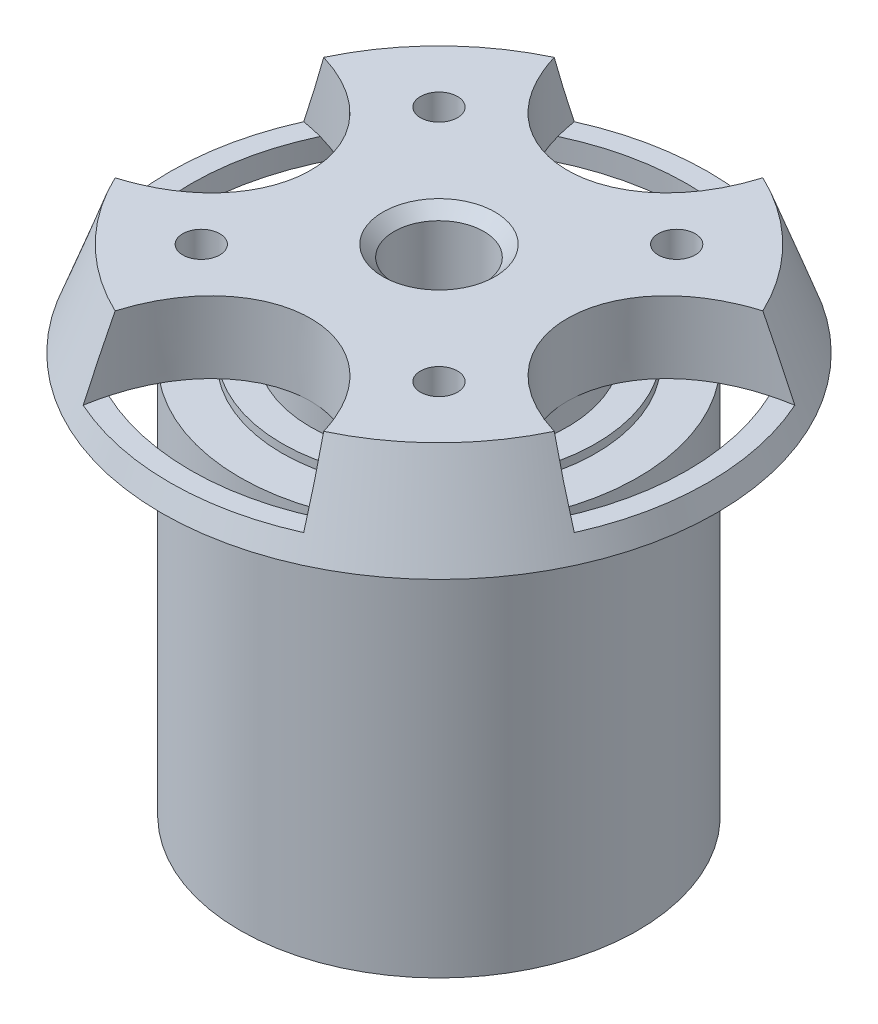
ISO-10303-21;
HEADER;
FILE_DESCRIPTION(('STEP AP214'),'2;1');
FILE_NAME('part.step','',(''),(''),'','','');
FILE_SCHEMA(('AUTOMOTIVE_DESIGN { 1 0 10303 214 1 1 1 1 }'));
ENDSEC;
DATA;
#1=APPLICATION_CONTEXT('core data for automotive mechanical design processes');
#2=APPLICATION_PROTOCOL_DEFINITION('international standard','automotive_design',2000,#1);
#3=PRODUCT_CONTEXT('',#1,'mechanical');
#4=PRODUCT('Part','Part','',(#3));
#5=PRODUCT_RELATED_PRODUCT_CATEGORY('part','',(#4));
#6=PRODUCT_DEFINITION_FORMATION('','',#4);
#7=PRODUCT_DEFINITION_CONTEXT('part definition',#1,'design');
#8=PRODUCT_DEFINITION('design','',#6,#7);
#9=PRODUCT_DEFINITION_SHAPE('','',#8);
#10=(LENGTH_UNIT() NAMED_UNIT(*) SI_UNIT(.MILLI.,.METRE.));
#11=(NAMED_UNIT(*) PLANE_ANGLE_UNIT() SI_UNIT($,.RADIAN.));
#12=(NAMED_UNIT(*) SI_UNIT($,.STERADIAN.) SOLID_ANGLE_UNIT());
#13=UNCERTAINTY_MEASURE_WITH_UNIT(LENGTH_MEASURE(1.E-05),#10,'distance_accuracy_value','');
#14=(GEOMETRIC_REPRESENTATION_CONTEXT(3) GLOBAL_UNCERTAINTY_ASSIGNED_CONTEXT((#13)) GLOBAL_UNIT_ASSIGNED_CONTEXT((#10,
#11,#12)) REPRESENTATION_CONTEXT('',''));
#15=CARTESIAN_POINT('',(0.,0.,0.));
#16=DIRECTION('',(0.,0.,1.));
#17=DIRECTION('',(1.,0.,0.));
#18=AXIS2_PLACEMENT_3D('',#15,#16,#17);
#19=CARTESIAN_POINT('',(0.,0.,0.));
#20=DIRECTION('',(0.,-1.,0.));
#21=DIRECTION('',(0.,0.,-1.));
#22=AXIS2_PLACEMENT_3D('',#19,#20,#21);
#23=CONICAL_SURFACE('',#22,21.6926500321639,0.349065850398867);
#24=CARTESIAN_POINT('',(9.30806662854048,0.,-19.594156298667));
#25=CARTESIAN_POINT('',(9.33645349830446,-0.267047114559313,-19.6882780547998));
#26=CARTESIAN_POINT('',(9.36403935939831,-0.534056252413507,-19.7827485386109));
#27=CARTESIAN_POINT('',(9.41762899385759,-1.06796669210553,-19.9723535420777));
#28=CARTESIAN_POINT('',(9.44363292784184,-1.33486800214883,-20.0674879932214));
#29=CARTESIAN_POINT('',(9.49408274903464,-1.86856773253177,-20.2584004093009));
#30=CARTESIAN_POINT('',(9.51852873826012,-2.13536615846896,-20.3541783316461));
#31=CARTESIAN_POINT('',(9.56588545307037,-2.66886527147613,-20.5463573710002));
#32=CARTESIAN_POINT('',(9.58879622657838,-2.93556596133833,-20.6427584684529));
#33=CARTESIAN_POINT('',(9.63310433714341,-3.46887325652315,-20.8361631457278));
#34=CARTESIAN_POINT('',(9.65450168054505,-3.73547986223553,-20.9331667230224));
#35=CARTESIAN_POINT('',(9.69580425870875,-4.26860624308783,-21.1277571172986));
#36=CARTESIAN_POINT('',(9.71570944184244,-4.53512601490593,-21.2253439543348));
#37=CARTESIAN_POINT('',(9.75404821296801,-5.06808443425027,-21.4210812477819));
#38=CARTESIAN_POINT('',(9.77248170357695,-5.33452307524784,-21.5192317410304));
#39=CARTESIAN_POINT('',(9.80789689017983,-5.86732501125397,-21.7160769996769));
#40=CARTESIAN_POINT('',(9.82487844646639,-6.13368829655945,-21.8147718164802));
#41=CARTESIAN_POINT('',(9.84114289802766,-6.4,-21.9137228830241));
#42=B_SPLINE_CURVE_WITH_KNOTS('',3,(#24,#25,#26,#27,#28,#29,#30,#31,#32,#33,#34,#35,#36,#37,#38,
#39,#40,#41),.UNSPECIFIED.,.F.,.F.,(4,2,2,2,2,2,2,2,4),(0.,0.853702016214532,1.70731720778205,
2.56087644558439,3.41440902627732,4.26793802855804,5.12149654911094,5.97511150350678,
6.82880850184122),.UNSPECIFIED.);
#43=CARTESIAN_POINT('',(9.30806662854051,0.,-19.5941562986671));
#44=VERTEX_POINT('',#43);
#45=CARTESIAN_POINT('',(9.84114289802766,-6.4,-21.9137228830241));
#46=VERTEX_POINT('',#45);
#47=EDGE_CURVE('E350',#44,#46,#42,.T.);
#48=ORIENTED_EDGE('',*,*,#47,.F.);
#49=CARTESIAN_POINT('',(0.,0.,0.));
#50=DIRECTION('',(0.,1.,0.));
#51=DIRECTION('',(0.,0.,1.));
#52=AXIS2_PLACEMENT_3D('',#49,#50,#51);
#53=CIRCLE('',#52,21.6926500321639);
#54=CARTESIAN_POINT('',(19.5941562986671,0.,-9.30806662854027));
#55=VERTEX_POINT('',#54);
#56=EDGE_CURVE('E348',#55,#44,#53,.T.);
#57=ORIENTED_EDGE('',*,*,#56,.F.);
#58=CARTESIAN_POINT('',(21.9137228830242,-6.4,-9.84114289802742));
#59=CARTESIAN_POINT('',(21.8147718164803,-6.13368829655945,-9.82487844646616));
#60=CARTESIAN_POINT('',(21.716076999677,-5.86732501125397,-9.8078968901796));
#61=CARTESIAN_POINT('',(21.5192317410305,-5.33452307524784,-9.77248170357672));
#62=CARTESIAN_POINT('',(21.421081247782,-5.06808443425027,-9.75404821296778));
#63=CARTESIAN_POINT('',(21.2253439543349,-4.53512601490593,-9.71570944184222));
#64=CARTESIAN_POINT('',(21.1277571172987,-4.26860624308782,-9.69580425870853));
#65=CARTESIAN_POINT('',(20.9331667230225,-3.73547986223553,-9.65450168054483));
#66=CARTESIAN_POINT('',(20.8361631457279,-3.46887325652315,-9.63310433714319));
#67=CARTESIAN_POINT('',(20.642758468453,-2.93556596133833,-9.58879622657817));
#68=CARTESIAN_POINT('',(20.5463573710003,-2.66886527147612,-9.56588545307015));
#69=CARTESIAN_POINT('',(20.3541783316462,-2.13536615846895,-9.51852873825991));
#70=CARTESIAN_POINT('',(20.258400409301,-1.86856773253177,-9.49408274903442));
#71=CARTESIAN_POINT('',(20.0674879932215,-1.33486800214883,-9.44363292784162));
#72=CARTESIAN_POINT('',(19.9723535420778,-1.06796669210553,-9.41762899385737));
#73=CARTESIAN_POINT('',(19.782748538611,-0.534056252413505,-9.3640393593981));
#74=CARTESIAN_POINT('',(19.6882780547999,-0.267047114559311,-9.33645349830426));
#75=CARTESIAN_POINT('',(19.5941562986671,0.,-9.30806662854027));
#76=B_SPLINE_CURVE_WITH_KNOTS('',3,(#58,#59,#60,#61,#62,#63,#64,#65,#66,#67,#68,#69,#70,#71,#72,
#73,#74,#75),.UNSPECIFIED.,.F.,.F.,(4,2,2,2,2,2,2,2,4),(0.,0.853696998334435,1.70731195273028,
2.56087047328318,3.4143994755639,4.26793205625684,5.12149129405917,5.97510648562669,
6.82880850184122),.UNSPECIFIED.);
#77=CARTESIAN_POINT('',(21.9137228830242,-6.4,-9.84114289802742));
#78=VERTEX_POINT('',#77);
#79=EDGE_CURVE('E223',#78,#55,#76,.T.);
#80=ORIENTED_EDGE('',*,*,#79,.F.);
#81=CARTESIAN_POINT('',(0.,-6.4,0.));
#82=DIRECTION('',(0.,-1.,0.));
#83=DIRECTION('',(0.,0.,-1.));
#84=AXIS2_PLACEMENT_3D('',#81,#82,#83);
#85=CIRCLE('',#84,24.0220595314676);
#86=CARTESIAN_POINT('',(21.913722883024,-6.4,9.84114289802788));
#87=VERTEX_POINT('',#86);
#88=EDGE_CURVE('E340',#87,#78,#85,.F.);
#89=ORIENTED_EDGE('',*,*,#88,.F.);
#90=CARTESIAN_POINT('',(19.5941562986669,0.,9.30806662854068));
#91=CARTESIAN_POINT('',(19.6882780547997,-0.267047114559311,9.33645349830467));
#92=CARTESIAN_POINT('',(19.7827485386108,-0.534056252413505,9.36403935939852));
#93=CARTESIAN_POINT('',(19.9723535420777,-1.06796669210553,9.41762899385779));
#94=CARTESIAN_POINT('',(20.0674879932213,-1.33486800214883,9.44363292784204));
#95=CARTESIAN_POINT('',(20.2584004093008,-1.86856773253177,9.49408274903485));
#96=CARTESIAN_POINT('',(20.354178331646,-2.13536615846895,9.51852873826034));
#97=CARTESIAN_POINT('',(20.5463573710001,-2.66886527147612,9.56588545307059));
#98=CARTESIAN_POINT('',(20.6427584684528,-2.93556596133833,9.5887962265786));
#99=CARTESIAN_POINT('',(20.8361631457277,-3.46887325652315,9.63310433714362));
#100=CARTESIAN_POINT('',(20.9331667230223,-3.73547986223553,9.65450168054527));
#101=CARTESIAN_POINT('',(21.1277571172985,-4.26860624308782,9.69580425870897));
#102=CARTESIAN_POINT('',(21.2253439543347,-4.53512601490593,9.71570944184266));
#103=CARTESIAN_POINT('',(21.4210812477818,-5.06808443425026,9.75404821296823));
#104=CARTESIAN_POINT('',(21.5192317410303,-5.33452307524784,9.77248170357718));
#105=CARTESIAN_POINT('',(21.7160769996768,-5.86732501125396,9.80789689018005));
#106=CARTESIAN_POINT('',(21.8147718164801,-6.13368829655944,9.82487844646661));
#107=CARTESIAN_POINT('',(21.913722883024,-6.4,9.84114289802788));
#108=B_SPLINE_CURVE_WITH_KNOTS('',3,(#90,#91,#92,#93,#94,#95,#96,#97,#98,#99,#100,#101,#102,
#103,#104,#105,#106,#107),.UNSPECIFIED.,.F.,.F.,(4,2,2,2,2,2,2,2,4),(0.,0.853702016214529,
1.70731720778205,2.56087644558438,3.41440902627731,4.26793802855803,5.12149654911093,
5.97511150350678,6.82880850184121),.UNSPECIFIED.);
#109=CARTESIAN_POINT('',(19.594156298667,0.,9.30806662854072));
#110=VERTEX_POINT('',#109);
#111=EDGE_CURVE('E231',#110,#87,#108,.T.);
#112=ORIENTED_EDGE('',*,*,#111,.F.);
#113=CARTESIAN_POINT('',(9.30806662854048,0.,19.594156298667));
#114=VERTEX_POINT('',#113);
#115=EDGE_CURVE('E353',#114,#110,#53,.T.);
#116=ORIENTED_EDGE('',*,*,#115,.F.);
#117=CARTESIAN_POINT('',(9.84114289802765,-6.4,21.9137228830241));
#118=CARTESIAN_POINT('',(9.82487844646638,-6.13368829655945,21.8147718164802));
#119=CARTESIAN_POINT('',(9.80789689017982,-5.86732501125397,21.7160769996769));
#120=CARTESIAN_POINT('',(9.77248170357695,-5.33452307524785,21.5192317410304));
#121=CARTESIAN_POINT('',(9.75404821296801,-5.06808443425027,21.4210812477819));
#122=CARTESIAN_POINT('',(9.71570944184244,-4.53512601490594,21.2253439543348));
#123=CARTESIAN_POINT('',(9.69580425870875,-4.26860624308783,21.1277571172986));
#124=CARTESIAN_POINT('',(9.65450168054505,-3.73547986223553,20.9331667230224));
#125=CARTESIAN_POINT('',(9.6331043371434,-3.46887325652315,20.8361631457278));
#126=CARTESIAN_POINT('',(9.58879622657838,-2.93556596133833,20.6427584684529));
#127=CARTESIAN_POINT('',(9.56588545307037,-2.66886527147613,20.5463573710002));
#128=CARTESIAN_POINT('',(9.51852873826012,-2.13536615846896,20.3541783316461));
#129=CARTESIAN_POINT('',(9.49408274903464,-1.86856773253177,20.2584004093009));
#130=CARTESIAN_POINT('',(9.44363292784183,-1.33486800214883,20.0674879932214));
#131=CARTESIAN_POINT('',(9.41762899385758,-1.06796669210553,19.9723535420777));
#132=CARTESIAN_POINT('',(9.36403935939831,-0.534056252413507,19.7827485386109));
#133=CARTESIAN_POINT('',(9.33645349830446,-0.267047114559312,19.6882780547998));
#134=CARTESIAN_POINT('',(9.30806662854048,0.,19.594156298667));
#135=B_SPLINE_CURVE_WITH_KNOTS('',3,(#117,#118,#119,#120,#121,#122,#123,#124,#125,#126,#127,
#128,#129,#130,#131,#132,#133,#134),.UNSPECIFIED.,.F.,.F.,(4,2,2,2,2,2,2,2,4),(0.,
0.853696998334435,1.70731195273028,2.56087047328318,3.4143994755639,4.26793205625683,
5.12149129405917,5.97510648562669,6.82880850184122),.UNSPECIFIED.);
#136=CARTESIAN_POINT('',(9.84114289802766,-6.4,21.9137228830241));
#137=VERTEX_POINT('',#136);
#138=EDGE_CURVE('E256',#137,#114,#135,.T.);
#139=ORIENTED_EDGE('',*,*,#138,.F.);
#140=CARTESIAN_POINT('',(0.,-6.4,0.));
#141=DIRECTION('',(0.,-1.,0.));
#142=DIRECTION('',(0.,0.,-1.));
#143=AXIS2_PLACEMENT_3D('',#140,#141,#142);
#144=CIRCLE('',#143,24.0220595314676);
#145=CARTESIAN_POINT('',(-9.84114289802766,-6.4,21.9137228830241));
#146=VERTEX_POINT('',#145);
#147=EDGE_CURVE('E389',#146,#137,#144,.F.);
#148=ORIENTED_EDGE('',*,*,#147,.F.);
#149=CARTESIAN_POINT('',(-9.30806662854047,0.,19.594156298667));
#150=CARTESIAN_POINT('',(-9.33645349830446,-0.267047114559313,19.6882780547998));
#151=CARTESIAN_POINT('',(-9.36403935939831,-0.534056252413508,19.7827485386109));
#152=CARTESIAN_POINT('',(-9.41762899385758,-1.06796669210553,19.9723535420777));
#153=CARTESIAN_POINT('',(-9.44363292784183,-1.33486800214883,20.0674879932214));
#154=CARTESIAN_POINT('',(-9.49408274903464,-1.86856773253177,20.2584004093009));
#155=CARTESIAN_POINT('',(-9.51852873826013,-2.13536615846895,20.3541783316461));
#156=CARTESIAN_POINT('',(-9.56588545307037,-2.66886527147612,20.5463573710002));
#157=CARTESIAN_POINT('',(-9.58879622657839,-2.93556596133833,20.6427584684529));
#158=CARTESIAN_POINT('',(-9.63310433714341,-3.46887325652315,20.8361631457278));
#159=CARTESIAN_POINT('',(-9.65450168054505,-3.73547986223553,20.9331667230224));
#160=CARTESIAN_POINT('',(-9.69580425870875,-4.26860624308783,21.1277571172986));
#161=CARTESIAN_POINT('',(-9.71570944184244,-4.53512601490593,21.2253439543348));
#162=CARTESIAN_POINT('',(-9.75404821296801,-5.06808443425027,21.4210812477819));
#163=CARTESIAN_POINT('',(-9.77248170357695,-5.33452307524784,21.5192317410304));
#164=CARTESIAN_POINT('',(-9.80789689017983,-5.86732501125397,21.7160769996769));
#165=CARTESIAN_POINT('',(-9.82487844646639,-6.13368829655945,21.8147718164802));
#166=CARTESIAN_POINT('',(-9.84114289802766,-6.4,21.9137228830241));
#167=B_SPLINE_CURVE_WITH_KNOTS('',3,(#149,#150,#151,#152,#153,#154,#155,#156,#157,#158,#159,
#160,#161,#162,#163,#164,#165,#166),.UNSPECIFIED.,.F.,.F.,(4,2,2,2,2,2,2,2,4),(0.,
0.853702016214531,1.70731720778205,2.56087644558438,3.41440902627732,4.26793802855804,
5.12149654911094,5.97511150350678,6.82880850184122),.UNSPECIFIED.);
#168=CARTESIAN_POINT('',(-9.30806662854051,0.,19.5941562986671));
#169=VERTEX_POINT('',#168);
#170=EDGE_CURVE('E266',#169,#146,#167,.T.);
#171=ORIENTED_EDGE('',*,*,#170,.F.);
#172=CARTESIAN_POINT('',(-19.594156298667,0.,9.30806662854041));
#173=VERTEX_POINT('',#172);
#174=EDGE_CURVE('E358',#173,#169,#53,.T.);
#175=ORIENTED_EDGE('',*,*,#174,.F.);
#176=CARTESIAN_POINT('',(-21.9137228830241,-6.4,9.84114289802758));
#177=CARTESIAN_POINT('',(-21.8147718164802,-6.13368829655945,9.82487844646631));
#178=CARTESIAN_POINT('',(-21.716076999677,-5.86732501125397,9.80789689017975));
#179=CARTESIAN_POINT('',(-21.5192317410304,-5.33452307524784,9.77248170357687));
#180=CARTESIAN_POINT('',(-21.4210812477819,-5.06808443425027,9.75404821296793));
#181=CARTESIAN_POINT('',(-21.2253439543349,-4.53512601490594,9.71570944184236));
#182=CARTESIAN_POINT('',(-21.1277571172987,-4.26860624308783,9.69580425870868));
#183=CARTESIAN_POINT('',(-20.9331667230224,-3.73547986223554,9.65450168054498));
#184=CARTESIAN_POINT('',(-20.8361631457278,-3.46887325652316,9.63310433714333));
#185=CARTESIAN_POINT('',(-20.6427584684529,-2.93556596133833,9.58879622657831));
#186=CARTESIAN_POINT('',(-20.5463573710002,-2.66886527147613,9.5658854530703));
#187=CARTESIAN_POINT('',(-20.3541783316461,-2.13536615846896,9.51852873826005));
#188=CARTESIAN_POINT('',(-20.2584004093009,-1.86856773253177,9.49408274903456));
#189=CARTESIAN_POINT('',(-20.0674879932215,-1.33486800214883,9.44363292784176));
#190=CARTESIAN_POINT('',(-19.9723535420778,-1.06796669210553,9.41762899385751));
#191=CARTESIAN_POINT('',(-19.7827485386109,-0.53405625241351,9.36403935939824));
#192=CARTESIAN_POINT('',(-19.6882780547998,-0.267047114559314,9.33645349830439));
#193=CARTESIAN_POINT('',(-19.594156298667,0.,9.30806662854041));
#194=B_SPLINE_CURVE_WITH_KNOTS('',3,(#176,#177,#178,#179,#180,#181,#182,#183,#184,#185,#186,
#187,#188,#189,#190,#191,#192,#193),.UNSPECIFIED.,.F.,.F.,(4,2,2,2,2,2,2,2,4),(0.,
0.853696998334433,1.70731195273028,2.56087047328318,3.4143994755639,4.26793205625683,
5.12149129405917,5.97510648562668,6.82880850184121),.UNSPECIFIED.);
#195=CARTESIAN_POINT('',(-21.9137228830241,-6.4,9.84114289802758));
#196=VERTEX_POINT('',#195);
#197=EDGE_CURVE('E274',#196,#173,#194,.T.);
#198=ORIENTED_EDGE('',*,*,#197,.F.);
#199=CARTESIAN_POINT('',(0.,-6.4,0.));
#200=DIRECTION('',(0.,-1.,0.));
#201=DIRECTION('',(0.,0.,-1.));
#202=AXIS2_PLACEMENT_3D('',#199,#200,#201);
#203=CIRCLE('',#202,24.0220595314676);
#204=CARTESIAN_POINT('',(-21.9137228830241,-6.4,-9.84114289802773));
#205=VERTEX_POINT('',#204);
#206=EDGE_CURVE('E342',#205,#196,#203,.F.);
#207=ORIENTED_EDGE('',*,*,#206,.F.);
#208=CARTESIAN_POINT('',(-19.594156298667,0.,-9.30806662854054));
#209=CARTESIAN_POINT('',(-19.6882780547998,-0.267047114559312,-9.33645349830453));
#210=CARTESIAN_POINT('',(-19.7827485386109,-0.534056252413505,-9.36403935939838));
#211=CARTESIAN_POINT('',(-19.9723535420777,-1.06796669210552,-9.41762899385765));
#212=CARTESIAN_POINT('',(-20.0674879932214,-1.33486800214883,-9.4436329278419));
#213=CARTESIAN_POINT('',(-20.2584004093009,-1.86856773253177,-9.49408274903471));
#214=CARTESIAN_POINT('',(-20.3541783316461,-2.13536615846895,-9.5185287382602));
#215=CARTESIAN_POINT('',(-20.5463573710001,-2.66886527147612,-9.56588545307044));
#216=CARTESIAN_POINT('',(-20.6427584684528,-2.93556596133833,-9.58879622657846));
#217=CARTESIAN_POINT('',(-20.8361631457278,-3.46887325652315,-9.63310433714348));
#218=CARTESIAN_POINT('',(-20.9331667230224,-3.73547986223553,-9.65450168054512));
#219=CARTESIAN_POINT('',(-21.1277571172986,-4.26860624308782,-9.69580425870883));
#220=CARTESIAN_POINT('',(-21.2253439543348,-4.53512601490593,-9.71570944184251));
#221=CARTESIAN_POINT('',(-21.4210812477818,-5.06808443425027,-9.75404821296808));
#222=CARTESIAN_POINT('',(-21.5192317410304,-5.33452307524784,-9.77248170357703));
#223=CARTESIAN_POINT('',(-21.7160769996769,-5.86732501125397,-9.8078968901799));
#224=CARTESIAN_POINT('',(-21.8147718164801,-6.13368829655945,-9.82487844646647));
#225=CARTESIAN_POINT('',(-21.9137228830241,-6.4,-9.84114289802773));
#226=B_SPLINE_CURVE_WITH_KNOTS('',3,(#208,#209,#210,#211,#212,#213,#214,#215,#216,#217,#218,
#219,#220,#221,#222,#223,#224,#225),.UNSPECIFIED.,.F.,.F.,(4,2,2,2,2,2,2,2,4),(0.,
0.853702016214529,1.70731720778205,2.56087644558438,3.41440902627732,4.26793802855804,
5.12149654911094,5.97511150350679,6.82880850184122),.UNSPECIFIED.);
#227=CARTESIAN_POINT('',(-19.5941562986671,0.,-9.30806662854058));
#228=VERTEX_POINT('',#227);
#229=EDGE_CURVE('E282',#228,#205,#226,.T.);
#230=ORIENTED_EDGE('',*,*,#229,.F.);
#231=CARTESIAN_POINT('',(-9.30806662854048,0.,-19.594156298667));
#232=VERTEX_POINT('',#231);
#233=EDGE_CURVE('E354',#232,#228,#53,.T.);
#234=ORIENTED_EDGE('',*,*,#233,.F.);
#235=CARTESIAN_POINT('',(-9.84114289802765,-6.4,-21.9137228830241));
#236=CARTESIAN_POINT('',(-9.82487844646638,-6.13368829655945,-21.8147718164802));
#237=CARTESIAN_POINT('',(-9.80789689017982,-5.86732501125397,-21.7160769996769));
#238=CARTESIAN_POINT('',(-9.77248170357695,-5.33452307524785,-21.5192317410304));
#239=CARTESIAN_POINT('',(-9.75404821296801,-5.06808443425027,-21.4210812477819));
#240=CARTESIAN_POINT('',(-9.71570944184244,-4.53512601490594,-21.2253439543348));
#241=CARTESIAN_POINT('',(-9.69580425870875,-4.26860624308783,-21.1277571172986));
#242=CARTESIAN_POINT('',(-9.65450168054505,-3.73547986223553,-20.9331667230224));
#243=CARTESIAN_POINT('',(-9.6331043371434,-3.46887325652315,-20.8361631457278));
#244=CARTESIAN_POINT('',(-9.58879622657838,-2.93556596133833,-20.6427584684529));
#245=CARTESIAN_POINT('',(-9.56588545307037,-2.66886527147613,-20.5463573710002));
#246=CARTESIAN_POINT('',(-9.51852873826012,-2.13536615846896,-20.3541783316461));
#247=CARTESIAN_POINT('',(-9.49408274903464,-1.86856773253177,-20.2584004093009));
#248=CARTESIAN_POINT('',(-9.44363292784183,-1.33486800214883,-20.0674879932214));
#249=CARTESIAN_POINT('',(-9.41762899385758,-1.06796669210553,-19.9723535420777));
#250=CARTESIAN_POINT('',(-9.36403935939831,-0.534056252413507,-19.7827485386109));
#251=CARTESIAN_POINT('',(-9.33645349830446,-0.267047114559312,-19.6882780547998));
#252=CARTESIAN_POINT('',(-9.30806662854048,0.,-19.594156298667));
#253=B_SPLINE_CURVE_WITH_KNOTS('',3,(#235,#236,#237,#238,#239,#240,#241,#242,#243,#244,#245,
#246,#247,#248,#249,#250,#251,#252),.UNSPECIFIED.,.F.,.F.,(4,2,2,2,2,2,2,2,4),(0.,
0.853696998334435,1.70731195273028,2.56087047328318,3.4143994755639,4.26793205625683,
5.12149129405917,5.97510648562669,6.82880850184122),.UNSPECIFIED.);
#254=CARTESIAN_POINT('',(-9.84114289802766,-6.4,-21.9137228830241));
#255=VERTEX_POINT('',#254);
#256=EDGE_CURVE('E237',#255,#232,#253,.T.);
#257=ORIENTED_EDGE('',*,*,#256,.F.);
#258=CARTESIAN_POINT('',(0.,-6.4,0.));
#259=DIRECTION('',(0.,-1.,0.));
#260=DIRECTION('',(0.,0.,-1.));
#261=AXIS2_PLACEMENT_3D('',#258,#259,#260);
#262=CIRCLE('',#261,24.0220595314676);
#263=EDGE_CURVE('E42',#46,#255,#262,.F.);
#264=ORIENTED_EDGE('',*,*,#263,.F.);
#265=EDGE_LOOP('',(#48,#57,#80,#89,#112,#116,#139,#148,#171,#175,#198,#207,#230,#234,#257,#264));
#266=FACE_BOUND('',#265,.T.);
#267=CARTESIAN_POINT('',(0.,-8.4,0.));
#268=DIRECTION('',(0.,1.,0.));
#269=DIRECTION('',(0.,0.,1.));
#270=AXIS2_PLACEMENT_3D('',#267,#268,#269);
#271=CIRCLE('',#270,24.75);
#272=CARTESIAN_POINT('',(0.,-8.4,24.75));
#273=VERTEX_POINT('',#272);
#274=EDGE_CURVE('E357',#273,#273,#271,.T.);
#275=ORIENTED_EDGE('',*,*,#274,.T.);
#276=EDGE_LOOP('',(#275));
#277=FACE_BOUND('',#276,.T.);
#278=ADVANCED_FACE('F34',(#266,#277),#23,.T.);
#279=CARTESIAN_POINT('',(0.,0.,0.));
#280=DIRECTION('',(0.,1.,0.));
#281=DIRECTION('',(0.,0.,1.));
#282=AXIS2_PLACEMENT_3D('',#279,#280,#281);
#283=PLANE('',#282);
#284=CARTESIAN_POINT('',(9.95,0.,-22.661862235924));
#285=CARTESIAN_POINT('',(8.05,0.,-7.71271258802532));
#286=CARTESIAN_POINT('',(-8.05,0.,-7.71271258802532));
#287=CARTESIAN_POINT('',(-9.95,0.,-22.661862235924));
#288=B_SPLINE_CURVE_WITH_KNOTS('',3,(#284,#285,#286,#287),.UNSPECIFIED.,.F.,.F.,(4,4),(0.,1.),.UNSPECIFIED.);
#289=EDGE_CURVE('E406',#232,#44,#288,.F.);
#290=ORIENTED_EDGE('',*,*,#289,.F.);
#291=ORIENTED_EDGE('',*,*,#233,.T.);
#292=CARTESIAN_POINT('',(-22.661862235924,0.,-9.95000000000008));
#293=CARTESIAN_POINT('',(-7.71271258802529,0.,-8.05000000000003));
#294=CARTESIAN_POINT('',(-7.71271258802535,0.,8.04999999999997));
#295=CARTESIAN_POINT('',(-22.6618622359241,0.,9.94999999999992));
#296=B_SPLINE_CURVE_WITH_KNOTS('',3,(#292,#293,#294,#295),.UNSPECIFIED.,.F.,.F.,(4,4),(0.,1.),.UNSPECIFIED.);
#297=EDGE_CURVE('E395',#173,#228,#296,.F.);
#298=ORIENTED_EDGE('',*,*,#297,.F.);
#299=ORIENTED_EDGE('',*,*,#174,.T.);
#300=CARTESIAN_POINT('',(-9.95,0.,22.661862235924));
#301=CARTESIAN_POINT('',(-8.05,0.,7.71271258802532));
#302=CARTESIAN_POINT('',(8.05,0.,7.71271258802532));
#303=CARTESIAN_POINT('',(9.95,0.,22.661862235924));
#304=B_SPLINE_CURVE_WITH_KNOTS('',3,(#300,#301,#302,#303),.UNSPECIFIED.,.F.,.F.,(4,4),(0.,1.),.UNSPECIFIED.);
#305=EDGE_CURVE('E384',#114,#169,#304,.F.);
#306=ORIENTED_EDGE('',*,*,#305,.F.);
#307=ORIENTED_EDGE('',*,*,#115,.T.);
#308=CARTESIAN_POINT('',(22.6618622359239,0.,9.95000000000024));
#309=CARTESIAN_POINT('',(7.71271258802524,0.,8.05000000000008));
#310=CARTESIAN_POINT('',(7.71271258802541,0.,-8.04999999999992));
#311=CARTESIAN_POINT('',(22.6618622359241,0.,-9.94999999999976));
#312=B_SPLINE_CURVE_WITH_KNOTS('',3,(#308,#309,#310,#311),.UNSPECIFIED.,.F.,.F.,(4,4),(0.,1.),.UNSPECIFIED.);
#313=EDGE_CURVE('E399',#55,#110,#312,.F.);
#314=ORIENTED_EDGE('',*,*,#313,.F.);
#315=ORIENTED_EDGE('',*,*,#56,.T.);
#316=EDGE_LOOP('',(#290,#291,#298,#299,#306,#307,#314,#315));
#317=FACE_BOUND('',#316,.T.);
#318=CARTESIAN_POINT('',(0.,0.,0.));
#319=DIRECTION('',(0.,1.,0.));
#320=DIRECTION('',(0.,0.,1.));
#321=AXIS2_PLACEMENT_3D('',#318,#319,#320);
#322=CIRCLE('',#321,4.99999999999997);
#323=CARTESIAN_POINT('',(0.,0.,4.99999999999997));
#324=VERTEX_POINT('',#323);
#325=EDGE_CURVE('E381',#324,#324,#322,.F.);
#326=ORIENTED_EDGE('',*,*,#325,.T.);
#327=EDGE_LOOP('',(#326));
#328=FACE_BOUND('',#327,.T.);
#329=CARTESIAN_POINT('',(10.6066017177982,0.,10.6066017177982));
#330=DIRECTION('',(0.,1.,0.));
#331=DIRECTION('',(0.,0.,1.));
#332=AXIS2_PLACEMENT_3D('',#329,#330,#331);
#333=CIRCLE('',#332,1.64999999999999);
#334=CARTESIAN_POINT('',(10.6066017177982,0.,12.2566017177982));
#335=VERTEX_POINT('',#334);
#336=EDGE_CURVE('E455',#335,#335,#333,.T.);
#337=ORIENTED_EDGE('',*,*,#336,.F.);
#338=EDGE_LOOP('',(#337));
#339=FACE_BOUND('',#338,.T.);
#340=CARTESIAN_POINT('',(-10.6066017177982,0.,10.6066017177982));
#341=DIRECTION('',(0.,1.,0.));
#342=DIRECTION('',(0.,0.,1.));
#343=AXIS2_PLACEMENT_3D('',#340,#341,#342);
#344=CIRCLE('',#343,1.64999999999999);
#345=CARTESIAN_POINT('',(-10.6066017177982,0.,12.2566017177982));
#346=VERTEX_POINT('',#345);
#347=EDGE_CURVE('E459',#346,#346,#344,.T.);
#348=ORIENTED_EDGE('',*,*,#347,.F.);
#349=EDGE_LOOP('',(#348));
#350=FACE_BOUND('',#349,.T.);
#351=CARTESIAN_POINT('',(-10.6066017177982,0.,-10.6066017177982));
#352=DIRECTION('',(0.,1.,0.));
#353=DIRECTION('',(0.,0.,1.));
#354=AXIS2_PLACEMENT_3D('',#351,#352,#353);
#355=CIRCLE('',#354,1.64999999999999);
#356=CARTESIAN_POINT('',(-10.6066017177982,0.,-8.95660171779822));
#357=VERTEX_POINT('',#356);
#358=EDGE_CURVE('E463',#357,#357,#355,.T.);
#359=ORIENTED_EDGE('',*,*,#358,.F.);
#360=EDGE_LOOP('',(#359));
#361=FACE_BOUND('',#360,.T.);
#362=CARTESIAN_POINT('',(10.6066017177982,0.,-10.6066017177982));
#363=DIRECTION('',(0.,1.,0.));
#364=DIRECTION('',(0.,0.,1.));
#365=AXIS2_PLACEMENT_3D('',#362,#363,#364);
#366=CIRCLE('',#365,1.64999999999999);
#367=CARTESIAN_POINT('',(10.6066017177982,0.,-8.95660171779822));
#368=VERTEX_POINT('',#367);
#369=EDGE_CURVE('E362',#368,#368,#366,.T.);
#370=ORIENTED_EDGE('',*,*,#369,.F.);
#371=EDGE_LOOP('',(#370));
#372=FACE_BOUND('',#371,.T.);
#373=ADVANCED_FACE('F247',(#317,#328,#339,#350,#361,#372),#283,.T.);
#374=CARTESIAN_POINT('',(0.,46.5537,0.));
#375=DIRECTION('',(0.,1.,0.));
#376=DIRECTION('',(0.,0.,1.));
#377=AXIS2_PLACEMENT_3D('',#374,#375,#376);
#378=CYLINDRICAL_SURFACE('',#377,3.99999999999997);
#379=CARTESIAN_POINT('',(0.,-0.999999999999994,0.));
#380=DIRECTION('',(0.,1.,0.));
#381=DIRECTION('',(0.,0.,1.));
#382=AXIS2_PLACEMENT_3D('',#379,#380,#381);
#383=CIRCLE('',#382,3.99999999999997);
#384=CARTESIAN_POINT('',(0.,-0.999999999999994,3.99999999999997));
#385=VERTEX_POINT('',#384);
#386=EDGE_CURVE('E378',#385,#385,#383,.T.);
#387=ORIENTED_EDGE('',*,*,#386,.T.);
#388=EDGE_LOOP('',(#387));
#389=FACE_BOUND('',#388,.T.);
#390=CARTESIAN_POINT('',(0.,-44.15,0.));
#391=DIRECTION('',(0.,1.,0.));
#392=DIRECTION('',(0.,0.,1.));
#393=AXIS2_PLACEMENT_3D('',#390,#391,#392);
#394=CIRCLE('',#393,3.99999999999997);
#395=CARTESIAN_POINT('',(0.,-44.15,3.99999999999997));
#396=VERTEX_POINT('',#395);
#397=EDGE_CURVE('E375',#396,#396,#394,.T.);
#398=ORIENTED_EDGE('',*,*,#397,.F.);
#399=EDGE_LOOP('',(#398));
#400=FACE_BOUND('',#399,.T.);
#401=ADVANCED_FACE('F249',(#389,#400),#378,.F.);
#402=CARTESIAN_POINT('',(0.,-8.4,0.));
#403=DIRECTION('',(0.,-1.,0.));
#404=DIRECTION('',(0.,0.,-1.));
#405=AXIS2_PLACEMENT_3D('',#402,#403,#404);
#406=PLANE('',#405);
#407=CARTESIAN_POINT('',(0.,-8.4,0.));
#408=DIRECTION('',(0.,1.,0.));
#409=DIRECTION('',(0.,0.,1.));
#410=AXIS2_PLACEMENT_3D('',#407,#408,#409);
#411=CIRCLE('',#410,22.15);
#412=CARTESIAN_POINT('',(0.,-8.4,22.15));
#413=VERTEX_POINT('',#412);
#414=EDGE_CURVE('E491',#413,#413,#411,.T.);
#415=ORIENTED_EDGE('',*,*,#414,.T.);
#416=EDGE_LOOP('',(#415));
#417=FACE_BOUND('',#416,.T.);
#418=ORIENTED_EDGE('',*,*,#274,.F.);
#419=EDGE_LOOP('',(#418));
#420=FACE_BOUND('',#419,.T.);
#421=ADVANCED_FACE('F251',(#417,#420),#406,.T.);
#422=CARTESIAN_POINT('',(0.,46.5537,0.));
#423=DIRECTION('',(0.,1.,0.));
#424=DIRECTION('',(0.,0.,1.));
#425=AXIS2_PLACEMENT_3D('',#422,#423,#424);
#426=CYLINDRICAL_SURFACE('',#425,14.);
#427=CARTESIAN_POINT('',(0.,-9.15000000000001,0.));
#428=DIRECTION('',(0.,1.,0.));
#429=DIRECTION('',(0.,0.,1.));
#430=AXIS2_PLACEMENT_3D('',#427,#428,#429);
#431=CIRCLE('',#430,14.);
#432=CARTESIAN_POINT('',(0.,-9.15000000000001,14.));
#433=VERTEX_POINT('',#432);
#434=EDGE_CURVE('E366',#433,#433,#431,.T.);
#435=ORIENTED_EDGE('',*,*,#434,.T.);
#436=EDGE_LOOP('',(#435));
#437=FACE_BOUND('',#436,.T.);
#438=CARTESIAN_POINT('',(0.,-8.4,0.));
#439=DIRECTION('',(0.,1.,0.));
#440=DIRECTION('',(0.,0.,1.));
#441=AXIS2_PLACEMENT_3D('',#438,#439,#440);
#442=CIRCLE('',#441,14.);
#443=CARTESIAN_POINT('',(0.,-8.4,14.));
#444=VERTEX_POINT('',#443);
#445=EDGE_CURVE('E194',#444,#444,#442,.F.);
#446=ORIENTED_EDGE('',*,*,#445,.T.);
#447=EDGE_LOOP('',(#446));
#448=FACE_BOUND('',#447,.T.);
#449=ADVANCED_FACE('F562',(#437,#448),#426,.T.);
#450=CARTESIAN_POINT('',(0.,-9.15,0.));
#451=DIRECTION('',(0.,1.,0.));
#452=DIRECTION('',(0.,0.,1.));
#453=AXIS2_PLACEMENT_3D('',#450,#451,#452);
#454=PLANE('',#453);
#455=CARTESIAN_POINT('',(0.,-9.15000000000001,0.));
#456=DIRECTION('',(0.,1.,0.));
#457=DIRECTION('',(0.,0.,1.));
#458=AXIS2_PLACEMENT_3D('',#455,#456,#457);
#459=CIRCLE('',#458,17.75);
#460=CARTESIAN_POINT('',(0.,-9.15000000000001,17.75));
#461=VERTEX_POINT('',#460);
#462=EDGE_CURVE('E369',#461,#461,#459,.T.);
#463=ORIENTED_EDGE('',*,*,#462,.T.);
#464=EDGE_LOOP('',(#463));
#465=FACE_BOUND('',#464,.T.);
#466=ORIENTED_EDGE('',*,*,#434,.F.);
#467=EDGE_LOOP('',(#466));
#468=FACE_BOUND('',#467,.T.);
#469=ADVANCED_FACE('F556',(#465,#468),#454,.T.);
#470=CARTESIAN_POINT('',(0.,46.5537,0.));
#471=DIRECTION('',(0.,1.,0.));
#472=DIRECTION('',(0.,0.,1.));
#473=AXIS2_PLACEMENT_3D('',#470,#471,#472);
#474=CYLINDRICAL_SURFACE('',#473,17.75);
#475=CARTESIAN_POINT('',(0.,-44.15,0.));
#476=DIRECTION('',(0.,1.,0.));
#477=DIRECTION('',(0.,0.,1.));
#478=AXIS2_PLACEMENT_3D('',#475,#476,#477);
#479=CIRCLE('',#478,17.75);
#480=CARTESIAN_POINT('',(0.,-44.15,17.75));
#481=VERTEX_POINT('',#480);
#482=EDGE_CURVE('E372',#481,#481,#479,.T.);
#483=ORIENTED_EDGE('',*,*,#482,.T.);
#484=EDGE_LOOP('',(#483));
#485=FACE_BOUND('',#484,.T.);
#486=ORIENTED_EDGE('',*,*,#462,.F.);
#487=EDGE_LOOP('',(#486));
#488=FACE_BOUND('',#487,.T.);
#489=ADVANCED_FACE('F527',(#485,#488),#474,.T.);
#490=CARTESIAN_POINT('',(0.,-44.15,0.));
#491=DIRECTION('',(0.,-1.,0.));
#492=DIRECTION('',(0.,0.,-1.));
#493=AXIS2_PLACEMENT_3D('',#490,#491,#492);
#494=PLANE('',#493);
#495=ORIENTED_EDGE('',*,*,#397,.T.);
#496=EDGE_LOOP('',(#495));
#497=FACE_BOUND('',#496,.T.);
#498=ORIENTED_EDGE('',*,*,#482,.F.);
#499=EDGE_LOOP('',(#498));
#500=FACE_BOUND('',#499,.T.);
#501=ADVANCED_FACE('F519',(#497,#500),#494,.T.);
#502=CARTESIAN_POINT('',(10.6066017177982,0.,-10.6066017177982));
#503=DIRECTION('',(0.,1.,0.));
#504=DIRECTION('',(0.,0.,1.));
#505=AXIS2_PLACEMENT_3D('',#502,#503,#504);
#506=CYLINDRICAL_SURFACE('',#505,1.64999999999999);
#507=CARTESIAN_POINT('',(10.6066017177982,-6.4,-10.6066017177982));
#508=DIRECTION('',(0.,1.,0.));
#509=DIRECTION('',(0.,0.,1.));
#510=AXIS2_PLACEMENT_3D('',#507,#508,#509);
#511=CIRCLE('',#510,1.64999999999999);
#512=CARTESIAN_POINT('',(10.6066017177982,-6.4,-8.95660171779822));
#513=VERTEX_POINT('',#512);
#514=EDGE_CURVE('E191',#513,#513,#511,.F.);
#515=ORIENTED_EDGE('',*,*,#514,.T.);
#516=EDGE_LOOP('',(#515));
#517=FACE_BOUND('',#516,.T.);
#518=ORIENTED_EDGE('',*,*,#369,.T.);
#519=EDGE_LOOP('',(#518));
#520=FACE_BOUND('',#519,.T.);
#521=ADVANCED_FACE('F516',(#517,#520),#506,.F.);
#522=CARTESIAN_POINT('',(-10.6066017177982,0.,-10.6066017177982));
#523=DIRECTION('',(0.,1.,0.));
#524=DIRECTION('',(0.,0.,1.));
#525=AXIS2_PLACEMENT_3D('',#522,#523,#524);
#526=CYLINDRICAL_SURFACE('',#525,1.64999999999999);
#527=CARTESIAN_POINT('',(-10.6066017177982,-6.4,-10.6066017177982));
#528=DIRECTION('',(0.,1.,0.));
#529=DIRECTION('',(0.,0.,1.));
#530=AXIS2_PLACEMENT_3D('',#527,#528,#529);
#531=CIRCLE('',#530,1.64999999999999);
#532=CARTESIAN_POINT('',(-10.6066017177982,-6.4,-8.95660171779822));
#533=VERTEX_POINT('',#532);
#534=EDGE_CURVE('E188',#533,#533,#531,.F.);
#535=ORIENTED_EDGE('',*,*,#534,.T.);
#536=EDGE_LOOP('',(#535));
#537=FACE_BOUND('',#536,.T.);
#538=ORIENTED_EDGE('',*,*,#358,.T.);
#539=EDGE_LOOP('',(#538));
#540=FACE_BOUND('',#539,.T.);
#541=ADVANCED_FACE('F518',(#537,#540),#526,.F.);
#542=CARTESIAN_POINT('',(-10.6066017177982,0.,10.6066017177982));
#543=DIRECTION('',(0.,1.,0.));
#544=DIRECTION('',(0.,0.,1.));
#545=AXIS2_PLACEMENT_3D('',#542,#543,#544);
#546=CYLINDRICAL_SURFACE('',#545,1.64999999999999);
#547=CARTESIAN_POINT('',(-10.6066017177982,-6.4,10.6066017177982));
#548=DIRECTION('',(0.,1.,0.));
#549=DIRECTION('',(0.,0.,1.));
#550=AXIS2_PLACEMENT_3D('',#547,#548,#549);
#551=CIRCLE('',#550,1.64999999999999);
#552=CARTESIAN_POINT('',(-10.6066017177982,-6.4,12.2566017177982));
#553=VERTEX_POINT('',#552);
#554=EDGE_CURVE('E174',#553,#553,#551,.F.);
#555=ORIENTED_EDGE('',*,*,#554,.T.);
#556=EDGE_LOOP('',(#555));
#557=FACE_BOUND('',#556,.T.);
#558=ORIENTED_EDGE('',*,*,#347,.T.);
#559=EDGE_LOOP('',(#558));
#560=FACE_BOUND('',#559,.T.);
#561=ADVANCED_FACE('F524',(#557,#560),#546,.F.);
#562=CARTESIAN_POINT('',(10.6066017177982,0.,10.6066017177982));
#563=DIRECTION('',(0.,1.,0.));
#564=DIRECTION('',(0.,0.,1.));
#565=AXIS2_PLACEMENT_3D('',#562,#563,#564);
#566=CYLINDRICAL_SURFACE('',#565,1.64999999999999);
#567=CARTESIAN_POINT('',(10.6066017177982,-6.4,10.6066017177982));
#568=DIRECTION('',(0.,1.,0.));
#569=DIRECTION('',(0.,0.,1.));
#570=AXIS2_PLACEMENT_3D('',#567,#568,#569);
#571=CIRCLE('',#570,1.64999999999999);
#572=CARTESIAN_POINT('',(10.6066017177982,-6.4,12.2566017177982));
#573=VERTEX_POINT('',#572);
#574=EDGE_CURVE('E172',#573,#573,#571,.F.);
#575=ORIENTED_EDGE('',*,*,#574,.T.);
#576=EDGE_LOOP('',(#575));
#577=FACE_BOUND('',#576,.T.);
#578=ORIENTED_EDGE('',*,*,#336,.T.);
#579=EDGE_LOOP('',(#578));
#580=FACE_BOUND('',#579,.T.);
#581=ADVANCED_FACE('F533',(#577,#580),#566,.F.);
#582=CARTESIAN_POINT('',(0.,-0.999999999999994,0.));
#583=DIRECTION('',(0.,1.,0.));
#584=DIRECTION('',(0.,0.,1.));
#585=AXIS2_PLACEMENT_3D('',#582,#583,#584);
#586=CONICAL_SURFACE('',#585,3.99999999999997,0.785398163397453);
#587=ORIENTED_EDGE('',*,*,#325,.F.);
#588=EDGE_LOOP('',(#587));
#589=FACE_BOUND('',#588,.T.);
#590=ORIENTED_EDGE('',*,*,#386,.F.);
#591=EDGE_LOOP('',(#590));
#592=FACE_BOUND('',#591,.T.);
#593=ADVANCED_FACE('F36',(#589,#592),#586,.F.);
#594=CARTESIAN_POINT('',(-9.95,0.,22.661862235924));
#595=CARTESIAN_POINT('',(-8.05,0.,7.71271258802532));
#596=CARTESIAN_POINT('',(8.05,0.,7.71271258802532));
#597=CARTESIAN_POINT('',(9.95,0.,22.661862235924));
#598=B_SPLINE_CURVE_WITH_KNOTS('',3,(#594,#595,#596,#597),.UNSPECIFIED.,.F.,.F.,(4,4),(0.,1.),.UNSPECIFIED.);
#599=DIRECTION('',(0.,-1.,0.));
#600=VECTOR('',#599,1.);
#601=SURFACE_OF_LINEAR_EXTRUSION('',#598,#600);
#602=ORIENTED_EDGE('',*,*,#170,.T.);
#603=CARTESIAN_POINT('',(-9.95,-6.4,22.661862235924));
#604=CARTESIAN_POINT('',(-8.05,-6.4,7.71271258802532));
#605=CARTESIAN_POINT('',(8.05,-6.4,7.71271258802532));
#606=CARTESIAN_POINT('',(9.95,-6.4,22.661862235924));
#607=B_SPLINE_CURVE_WITH_KNOTS('',3,(#603,#604,#605,#606),.UNSPECIFIED.,.F.,.F.,(4,4),(0.,1.),.UNSPECIFIED.);
#608=CARTESIAN_POINT('',(-9.43579785225076,-6.4,20.0396661372254));
#609=VERTEX_POINT('',#608);
#610=EDGE_CURVE('E171',#146,#609,#607,.T.);
#611=ORIENTED_EDGE('',*,*,#610,.T.);
#612=CARTESIAN_POINT('',(-9.95,-6.4,22.661862235924));
#613=CARTESIAN_POINT('',(-8.05,-6.4,7.71271258802532));
#614=CARTESIAN_POINT('',(8.05,-6.4,7.71271258802532));
#615=CARTESIAN_POINT('',(9.95,-6.4,22.661862235924));
#616=B_SPLINE_CURVE_WITH_KNOTS('',3,(#612,#613,#614,#615),.UNSPECIFIED.,.F.,.F.,(4,4),(0.,1.),.UNSPECIFIED.);
#617=CARTESIAN_POINT('',(0.,-6.4,11.45));
#618=VERTEX_POINT('',#617);
#619=EDGE_CURVE('E147',#609,#618,#616,.T.);
#620=ORIENTED_EDGE('',*,*,#619,.T.);
#621=CARTESIAN_POINT('',(9.43579785225076,-6.4,20.0396661372254));
#622=VERTEX_POINT('',#621);
#623=EDGE_CURVE('E135',#618,#622,#616,.T.);
#624=ORIENTED_EDGE('',*,*,#623,.T.);
#625=EDGE_CURVE('E420',#622,#137,#607,.T.);
#626=ORIENTED_EDGE('',*,*,#625,.T.);
#627=ORIENTED_EDGE('',*,*,#138,.T.);
#628=ORIENTED_EDGE('',*,*,#305,.T.);
#629=EDGE_LOOP('',(#602,#611,#620,#624,#626,#627,#628));
#630=FACE_BOUND('',#629,.T.);
#631=ADVANCED_FACE('F169',(#630),#601,.F.);
#632=CARTESIAN_POINT('',(0.,-6.4,11.45));
#633=DIRECTION('',(0.,-1.,0.));
#634=DIRECTION('',(0.,0.,-1.));
#635=AXIS2_PLACEMENT_3D('',#632,#633,#634);
#636=PLANE('',#635);
#637=ORIENTED_EDGE('',*,*,#625,.F.);
#638=CARTESIAN_POINT('',(0.,-6.4,0.));
#639=DIRECTION('',(0.,1.,0.));
#640=DIRECTION('',(0.,0.,1.));
#641=AXIS2_PLACEMENT_3D('',#638,#639,#640);
#642=CIRCLE('',#641,22.15);
#643=EDGE_CURVE('E485',#609,#622,#642,.T.);
#644=ORIENTED_EDGE('',*,*,#643,.F.);
#645=ORIENTED_EDGE('',*,*,#610,.F.);
#646=ORIENTED_EDGE('',*,*,#147,.T.);
#647=EDGE_LOOP('',(#637,#644,#645,#646));
#648=FACE_BOUND('',#647,.T.);
#649=ADVANCED_FACE('F294',(#648),#636,.F.);
#650=CARTESIAN_POINT('',(-22.661862235924,0.,-9.95000000000008));
#651=CARTESIAN_POINT('',(-7.71271258802529,0.,-8.05000000000003));
#652=CARTESIAN_POINT('',(-7.71271258802535,0.,8.04999999999997));
#653=CARTESIAN_POINT('',(-22.6618622359241,0.,9.94999999999992));
#654=B_SPLINE_CURVE_WITH_KNOTS('',3,(#650,#651,#652,#653),.UNSPECIFIED.,.F.,.F.,(4,4),(0.,1.),.UNSPECIFIED.);
#655=DIRECTION('',(0.,-1.,0.));
#656=VECTOR('',#655,1.);
#657=SURFACE_OF_LINEAR_EXTRUSION('',#654,#656);
#658=ORIENTED_EDGE('',*,*,#229,.T.);
#659=CARTESIAN_POINT('',(-22.661862235924,-6.4,-9.95000000000008));
#660=CARTESIAN_POINT('',(-7.71271258802529,-6.4,-8.05000000000003));
#661=CARTESIAN_POINT('',(-7.71271258802535,-6.4,8.04999999999997));
#662=CARTESIAN_POINT('',(-22.6618622359241,-6.4,9.94999999999992));
#663=B_SPLINE_CURVE_WITH_KNOTS('',3,(#659,#660,#661,#662),.UNSPECIFIED.,.F.,.F.,(4,4),(0.,1.),.UNSPECIFIED.);
#664=CARTESIAN_POINT('',(-20.0396661372254,-6.4,-9.43579785225083));
#665=VERTEX_POINT('',#664);
#666=EDGE_CURVE('E304',#205,#665,#663,.T.);
#667=ORIENTED_EDGE('',*,*,#666,.T.);
#668=CARTESIAN_POINT('',(-22.661862235924,-6.4,-9.95000000000008));
#669=CARTESIAN_POINT('',(-7.71271258802529,-6.4,-8.05000000000003));
#670=CARTESIAN_POINT('',(-7.71271258802535,-6.4,8.04999999999997));
#671=CARTESIAN_POINT('',(-22.6618622359241,-6.4,9.94999999999992));
#672=B_SPLINE_CURVE_WITH_KNOTS('',3,(#668,#669,#670,#671),.UNSPECIFIED.,.F.,.F.,(4,4),(0.,1.),.UNSPECIFIED.);
#673=CARTESIAN_POINT('',(-11.45,-6.4,0.));
#674=VERTEX_POINT('',#673);
#675=EDGE_CURVE('E148',#665,#674,#672,.T.);
#676=ORIENTED_EDGE('',*,*,#675,.T.);
#677=CARTESIAN_POINT('',(-20.0396661372255,-6.4,9.43579785225069));
#678=VERTEX_POINT('',#677);
#679=EDGE_CURVE('E157',#674,#678,#672,.T.);
#680=ORIENTED_EDGE('',*,*,#679,.T.);
#681=EDGE_CURVE('E311',#678,#196,#663,.T.);
#682=ORIENTED_EDGE('',*,*,#681,.T.);
#683=ORIENTED_EDGE('',*,*,#197,.T.);
#684=ORIENTED_EDGE('',*,*,#297,.T.);
#685=EDGE_LOOP('',(#658,#667,#676,#680,#682,#683,#684));
#686=FACE_BOUND('',#685,.T.);
#687=ADVANCED_FACE('F288',(#686),#657,.F.);
#688=CARTESIAN_POINT('',(-11.45,-6.4,0.));
#689=DIRECTION('',(0.,-1.,0.));
#690=DIRECTION('',(1.,0.,0.));
#691=AXIS2_PLACEMENT_3D('',#688,#689,#690);
#692=PLANE('',#691);
#693=ORIENTED_EDGE('',*,*,#681,.F.);
#694=EDGE_CURVE('E487',#665,#678,#642,.T.);
#695=ORIENTED_EDGE('',*,*,#694,.F.);
#696=ORIENTED_EDGE('',*,*,#666,.F.);
#697=ORIENTED_EDGE('',*,*,#206,.T.);
#698=EDGE_LOOP('',(#693,#695,#696,#697));
#699=FACE_BOUND('',#698,.T.);
#700=ADVANCED_FACE('F216',(#699),#692,.F.);
#701=CARTESIAN_POINT('',(22.6618622359239,0.,9.95000000000024));
#702=CARTESIAN_POINT('',(7.71271258802524,0.,8.05000000000008));
#703=CARTESIAN_POINT('',(7.71271258802541,0.,-8.04999999999992));
#704=CARTESIAN_POINT('',(22.6618622359241,0.,-9.94999999999976));
#705=B_SPLINE_CURVE_WITH_KNOTS('',3,(#701,#702,#703,#704),.UNSPECIFIED.,.F.,.F.,(4,4),(0.,1.),.UNSPECIFIED.);
#706=DIRECTION('',(0.,-1.,0.));
#707=VECTOR('',#706,1.);
#708=SURFACE_OF_LINEAR_EXTRUSION('',#705,#707);
#709=ORIENTED_EDGE('',*,*,#111,.T.);
#710=CARTESIAN_POINT('',(22.6618622359239,-6.4,9.95000000000024));
#711=CARTESIAN_POINT('',(7.71271258802524,-6.4,8.05000000000008));
#712=CARTESIAN_POINT('',(7.71271258802541,-6.4,-8.04999999999992));
#713=CARTESIAN_POINT('',(22.6618622359241,-6.4,-9.94999999999976));
#714=B_SPLINE_CURVE_WITH_KNOTS('',3,(#710,#711,#712,#713),.UNSPECIFIED.,.F.,.F.,(4,4),(0.,1.),.UNSPECIFIED.);
#715=CARTESIAN_POINT('',(20.0396661372253,-6.4,9.43579785225097));
#716=VERTEX_POINT('',#715);
#717=EDGE_CURVE('E202',#87,#716,#714,.T.);
#718=ORIENTED_EDGE('',*,*,#717,.T.);
#719=CARTESIAN_POINT('',(22.6618622359239,-6.4,9.95000000000024));
#720=CARTESIAN_POINT('',(7.71271258802524,-6.4,8.05000000000008));
#721=CARTESIAN_POINT('',(7.71271258802541,-6.4,-8.04999999999992));
#722=CARTESIAN_POINT('',(22.6618622359241,-6.4,-9.94999999999976));
#723=B_SPLINE_CURVE_WITH_KNOTS('',3,(#719,#720,#721,#722),.UNSPECIFIED.,.F.,.F.,(4,4),(0.,1.),.UNSPECIFIED.);
#724=CARTESIAN_POINT('',(11.45,-6.4,1.196959198424E-13));
#725=VERTEX_POINT('',#724);
#726=EDGE_CURVE('E500',#716,#725,#723,.T.);
#727=ORIENTED_EDGE('',*,*,#726,.T.);
#728=CARTESIAN_POINT('',(20.0396661372255,-6.4,-9.43579785225055));
#729=VERTEX_POINT('',#728);
#730=EDGE_CURVE('E336',#725,#729,#723,.T.);
#731=ORIENTED_EDGE('',*,*,#730,.T.);
#732=EDGE_CURVE('E197',#729,#78,#714,.T.);
#733=ORIENTED_EDGE('',*,*,#732,.T.);
#734=ORIENTED_EDGE('',*,*,#79,.T.);
#735=ORIENTED_EDGE('',*,*,#313,.T.);
#736=EDGE_LOOP('',(#709,#718,#727,#731,#733,#734,#735));
#737=FACE_BOUND('',#736,.T.);
#738=ADVANCED_FACE('F210',(#737),#708,.F.);
#739=CARTESIAN_POINT('',(11.45,-6.4,1.19932383989262E-13));
#740=DIRECTION('',(0.,-1.,0.));
#741=DIRECTION('',(-1.,0.,0.));
#742=AXIS2_PLACEMENT_3D('',#739,#740,#741);
#743=PLANE('',#742);
#744=ORIENTED_EDGE('',*,*,#732,.F.);
#745=EDGE_CURVE('E492',#716,#729,#642,.T.);
#746=ORIENTED_EDGE('',*,*,#745,.F.);
#747=ORIENTED_EDGE('',*,*,#717,.F.);
#748=ORIENTED_EDGE('',*,*,#88,.T.);
#749=EDGE_LOOP('',(#744,#746,#747,#748));
#750=FACE_BOUND('',#749,.T.);
#751=ADVANCED_FACE('F215',(#750),#743,.F.);
#752=CARTESIAN_POINT('',(9.95,0.,-22.661862235924));
#753=CARTESIAN_POINT('',(8.05,0.,-7.71271258802532));
#754=CARTESIAN_POINT('',(-8.05,0.,-7.71271258802532));
#755=CARTESIAN_POINT('',(-9.95,0.,-22.661862235924));
#756=B_SPLINE_CURVE_WITH_KNOTS('',3,(#752,#753,#754,#755),.UNSPECIFIED.,.F.,.F.,(4,4),(0.,1.),.UNSPECIFIED.);
#757=DIRECTION('',(0.,-1.,0.));
#758=VECTOR('',#757,1.);
#759=SURFACE_OF_LINEAR_EXTRUSION('',#756,#758);
#760=ORIENTED_EDGE('',*,*,#47,.T.);
#761=CARTESIAN_POINT('',(9.95,-6.4,-22.661862235924));
#762=CARTESIAN_POINT('',(8.05,-6.4,-7.71271258802532));
#763=CARTESIAN_POINT('',(-8.05,-6.4,-7.71271258802532));
#764=CARTESIAN_POINT('',(-9.95,-6.4,-22.661862235924));
#765=B_SPLINE_CURVE_WITH_KNOTS('',3,(#761,#762,#763,#764),.UNSPECIFIED.,.F.,.F.,(4,4),(0.,1.),.UNSPECIFIED.);
#766=CARTESIAN_POINT('',(9.43579785225076,-6.4,-20.0396661372254));
#767=VERTEX_POINT('',#766);
#768=EDGE_CURVE('E301',#46,#767,#765,.T.);
#769=ORIENTED_EDGE('',*,*,#768,.T.);
#770=CARTESIAN_POINT('',(0.,-6.4,-11.45));
#771=VERTEX_POINT('',#770);
#772=EDGE_CURVE('E320',#767,#771,#765,.T.);
#773=ORIENTED_EDGE('',*,*,#772,.T.);
#774=CARTESIAN_POINT('',(-9.43579785225076,-6.4,-20.0396661372254));
#775=VERTEX_POINT('',#774);
#776=EDGE_CURVE('E325',#771,#775,#765,.T.);
#777=ORIENTED_EDGE('',*,*,#776,.T.);
#778=EDGE_CURVE('E321',#775,#255,#765,.T.);
#779=ORIENTED_EDGE('',*,*,#778,.T.);
#780=ORIENTED_EDGE('',*,*,#256,.T.);
#781=ORIENTED_EDGE('',*,*,#289,.T.);
#782=EDGE_LOOP('',(#760,#769,#773,#777,#779,#780,#781));
#783=FACE_BOUND('',#782,.T.);
#784=ADVANCED_FACE('F429',(#783),#759,.F.);
#785=CARTESIAN_POINT('',(0.,-6.4,-11.45));
#786=DIRECTION('',(0.,-1.,0.));
#787=DIRECTION('',(0.,0.,1.));
#788=AXIS2_PLACEMENT_3D('',#785,#786,#787);
#789=PLANE('',#788);
#790=ORIENTED_EDGE('',*,*,#778,.F.);
#791=CARTESIAN_POINT('',(0.,-6.4,0.));
#792=DIRECTION('',(0.,-1.,0.));
#793=DIRECTION('',(0.,0.,-1.));
#794=AXIS2_PLACEMENT_3D('',#791,#792,#793);
#795=CIRCLE('',#794,22.15);
#796=EDGE_CURVE('E11',#775,#767,#795,.T.);
#797=ORIENTED_EDGE('',*,*,#796,.T.);
#798=ORIENTED_EDGE('',*,*,#768,.F.);
#799=ORIENTED_EDGE('',*,*,#263,.T.);
#800=EDGE_LOOP('',(#790,#797,#798,#799));
#801=FACE_BOUND('',#800,.T.);
#802=ADVANCED_FACE('F219',(#801),#789,.F.);
#803=CARTESIAN_POINT('',(0.,-8.4,0.));
#804=DIRECTION('',(0.,1.,0.));
#805=DIRECTION('',(0.,0.,1.));
#806=AXIS2_PLACEMENT_3D('',#803,#804,#805);
#807=PLANE('',#806);
#808=ORIENTED_EDGE('',*,*,#445,.F.);
#809=EDGE_LOOP('',(#808));
#810=FACE_BOUND('',#809,.T.);
#811=CARTESIAN_POINT('',(0.,-8.4,0.));
#812=DIRECTION('',(0.,1.,0.));
#813=DIRECTION('',(0.,0.,1.));
#814=AXIS2_PLACEMENT_3D('',#811,#812,#813);
#815=CIRCLE('',#814,11.45);
#816=CARTESIAN_POINT('',(0.,-8.4,11.45));
#817=VERTEX_POINT('',#816);
#818=EDGE_CURVE('E167',#817,#817,#815,.T.);
#819=ORIENTED_EDGE('',*,*,#818,.F.);
#820=EDGE_LOOP('',(#819));
#821=FACE_BOUND('',#820,.T.);
#822=ADVANCED_FACE('F443',(#810,#821),#807,.T.);
#823=CARTESIAN_POINT('',(0.,-6.4,0.));
#824=DIRECTION('',(0.,1.,0.));
#825=DIRECTION('',(0.,0.,1.));
#826=AXIS2_PLACEMENT_3D('',#823,#824,#825);
#827=PLANE('',#826);
#828=CARTESIAN_POINT('',(0.,-6.4,0.));
#829=DIRECTION('',(0.,1.,0.));
#830=DIRECTION('',(0.,0.,1.));
#831=AXIS2_PLACEMENT_3D('',#828,#829,#830);
#832=CIRCLE('',#831,11.45);
#833=EDGE_CURVE('E166',#725,#771,#832,.T.);
#834=ORIENTED_EDGE('',*,*,#833,.T.);
#835=ORIENTED_EDGE('',*,*,#772,.F.);
#836=EDGE_CURVE('E495',#729,#767,#642,.T.);
#837=ORIENTED_EDGE('',*,*,#836,.F.);
#838=ORIENTED_EDGE('',*,*,#730,.F.);
#839=EDGE_LOOP('',(#834,#835,#837,#838));
#840=FACE_BOUND('',#839,.T.);
#841=ORIENTED_EDGE('',*,*,#514,.F.);
#842=EDGE_LOOP('',(#841));
#843=FACE_BOUND('',#842,.T.);
#844=ADVANCED_FACE('F510',(#840,#843),#827,.F.);
#845=EDGE_CURVE('E55',#775,#665,#642,.T.);
#846=ORIENTED_EDGE('',*,*,#845,.F.);
#847=ORIENTED_EDGE('',*,*,#776,.F.);
#848=EDGE_CURVE('E161',#771,#674,#832,.T.);
#849=ORIENTED_EDGE('',*,*,#848,.T.);
#850=ORIENTED_EDGE('',*,*,#675,.F.);
#851=EDGE_LOOP('',(#846,#847,#849,#850));
#852=FACE_BOUND('',#851,.T.);
#853=ORIENTED_EDGE('',*,*,#534,.F.);
#854=EDGE_LOOP('',(#853));
#855=FACE_BOUND('',#854,.T.);
#856=ADVANCED_FACE('F507',(#852,#855),#827,.F.);
#857=EDGE_CURVE('E49',#678,#609,#642,.T.);
#858=ORIENTED_EDGE('',*,*,#857,.F.);
#859=ORIENTED_EDGE('',*,*,#679,.F.);
#860=EDGE_CURVE('E152',#674,#618,#832,.T.);
#861=ORIENTED_EDGE('',*,*,#860,.T.);
#862=ORIENTED_EDGE('',*,*,#619,.F.);
#863=EDGE_LOOP('',(#858,#859,#861,#862));
#864=FACE_BOUND('',#863,.T.);
#865=ORIENTED_EDGE('',*,*,#554,.F.);
#866=EDGE_LOOP('',(#865));
#867=FACE_BOUND('',#866,.T.);
#868=ADVANCED_FACE('F153',(#864,#867),#827,.F.);
#869=EDGE_CURVE('E141',#618,#725,#832,.T.);
#870=ORIENTED_EDGE('',*,*,#869,.T.);
#871=ORIENTED_EDGE('',*,*,#726,.F.);
#872=EDGE_CURVE('E143',#622,#716,#642,.T.);
#873=ORIENTED_EDGE('',*,*,#872,.F.);
#874=ORIENTED_EDGE('',*,*,#623,.F.);
#875=EDGE_LOOP('',(#870,#871,#873,#874));
#876=FACE_BOUND('',#875,.T.);
#877=ORIENTED_EDGE('',*,*,#574,.F.);
#878=EDGE_LOOP('',(#877));
#879=FACE_BOUND('',#878,.T.);
#880=ADVANCED_FACE('F137',(#876,#879),#827,.F.);
#881=CARTESIAN_POINT('',(0.,-8.4,0.));
#882=DIRECTION('',(0.,1.,0.));
#883=DIRECTION('',(0.,0.,1.));
#884=AXIS2_PLACEMENT_3D('',#881,#882,#883);
#885=CYLINDRICAL_SURFACE('',#884,22.15);
#886=ORIENTED_EDGE('',*,*,#414,.F.);
#887=EDGE_LOOP('',(#886));
#888=FACE_BOUND('',#887,.T.);
#889=ORIENTED_EDGE('',*,*,#872,.T.);
#890=ORIENTED_EDGE('',*,*,#745,.T.);
#891=ORIENTED_EDGE('',*,*,#836,.T.);
#892=ORIENTED_EDGE('',*,*,#796,.F.);
#893=ORIENTED_EDGE('',*,*,#845,.T.);
#894=ORIENTED_EDGE('',*,*,#694,.T.);
#895=ORIENTED_EDGE('',*,*,#857,.T.);
#896=ORIENTED_EDGE('',*,*,#643,.T.);
#897=EDGE_LOOP('',(#889,#890,#891,#892,#893,#894,#895,#896));
#898=FACE_BOUND('',#897,.T.);
#899=ADVANCED_FACE('F498',(#888,#898),#885,.F.);
#900=CARTESIAN_POINT('',(0.,-8.4,0.));
#901=DIRECTION('',(0.,1.,0.));
#902=DIRECTION('',(0.,0.,1.));
#903=AXIS2_PLACEMENT_3D('',#900,#901,#902);
#904=CYLINDRICAL_SURFACE('',#903,11.45);
#905=ORIENTED_EDGE('',*,*,#818,.T.);
#906=EDGE_LOOP('',(#905));
#907=FACE_BOUND('',#906,.T.);
#908=ORIENTED_EDGE('',*,*,#869,.F.);
#909=ORIENTED_EDGE('',*,*,#860,.F.);
#910=ORIENTED_EDGE('',*,*,#848,.F.);
#911=ORIENTED_EDGE('',*,*,#833,.F.);
#912=EDGE_LOOP('',(#908,#909,#910,#911));
#913=FACE_BOUND('',#912,.T.);
#914=ADVANCED_FACE('F164',(#907,#913),#904,.T.);
#915=CLOSED_SHELL('',(#278,#373,#401,#421,#449,#469,#489,#501,#521,#541,#561,#581,#593,#631,
#649,#687,#700,#738,#751,#784,#802,#822,#844,#856,#868,#880,#899,#914));
#916=MANIFOLD_SOLID_BREP('B2',#915);
#917=ADVANCED_BREP_SHAPE_REPRESENTATION('',(#18,#916),#14);
#918=SHAPE_DEFINITION_REPRESENTATION(#9,#917);
ENDSEC;
END-ISO-10303-21;
